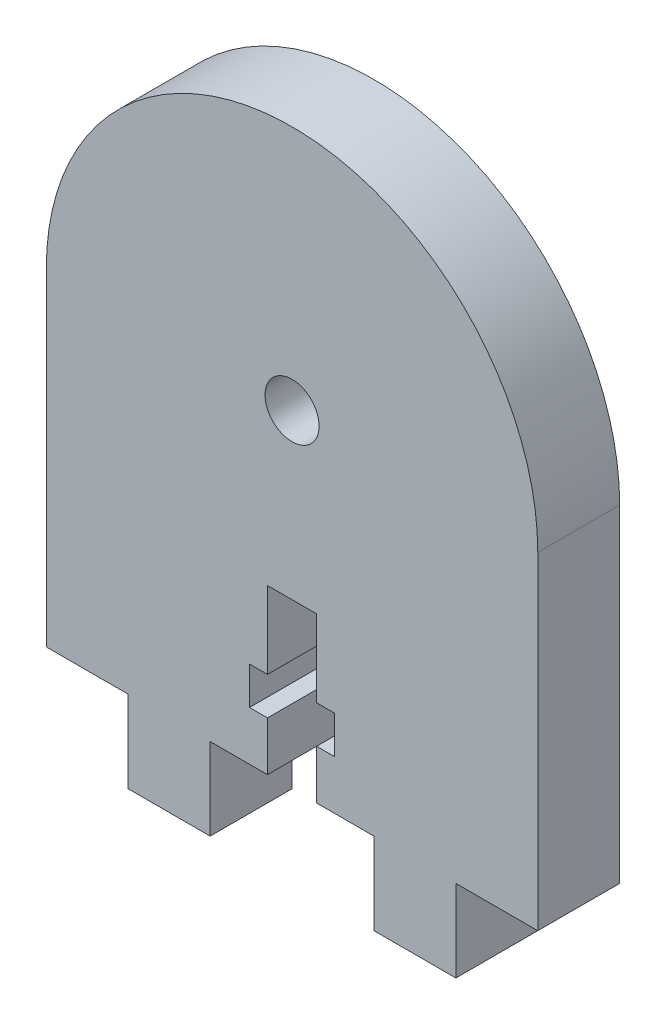
ISO-10303-21;
HEADER;
FILE_DESCRIPTION(('STEP AP214'),'2;1');
FILE_NAME('part.step','',(''),(''),'','','');
FILE_SCHEMA(('AUTOMOTIVE_DESIGN { 1 0 10303 214 1 1 1 1 }'));
ENDSEC;
DATA;
#1=APPLICATION_CONTEXT('core data for automotive mechanical design processes');
#2=APPLICATION_PROTOCOL_DEFINITION('international standard','automotive_design',2000,#1);
#3=PRODUCT_CONTEXT('',#1,'mechanical');
#4=PRODUCT('Part','Part','',(#3));
#5=PRODUCT_RELATED_PRODUCT_CATEGORY('part','',(#4));
#6=PRODUCT_DEFINITION_FORMATION('','',#4);
#7=PRODUCT_DEFINITION_CONTEXT('part definition',#1,'design');
#8=PRODUCT_DEFINITION('design','',#6,#7);
#9=PRODUCT_DEFINITION_SHAPE('','',#8);
#10=(LENGTH_UNIT() NAMED_UNIT(*) SI_UNIT(.MILLI.,.METRE.));
#11=(NAMED_UNIT(*) PLANE_ANGLE_UNIT() SI_UNIT($,.RADIAN.));
#12=(NAMED_UNIT(*) SI_UNIT($,.STERADIAN.) SOLID_ANGLE_UNIT());
#13=UNCERTAINTY_MEASURE_WITH_UNIT(LENGTH_MEASURE(1.E-05),#10,'distance_accuracy_value','');
#14=(GEOMETRIC_REPRESENTATION_CONTEXT(3) GLOBAL_UNCERTAINTY_ASSIGNED_CONTEXT((#13)) GLOBAL_UNIT_ASSIGNED_CONTEXT((#10,
#11,#12)) REPRESENTATION_CONTEXT('',''));
#15=CARTESIAN_POINT('',(0.,0.,0.));
#16=DIRECTION('',(0.,0.,1.));
#17=DIRECTION('',(1.,0.,0.));
#18=AXIS2_PLACEMENT_3D('',#15,#16,#17);
#19=CARTESIAN_POINT('',(0.,20.,5.));
#20=DIRECTION('',(0.,0.,-1.));
#21=DIRECTION('',(-1.,0.,0.));
#22=AXIS2_PLACEMENT_3D('',#19,#20,#21);
#23=PLANE('',#22);
#24=DIRECTION('',(0.,-1.,0.));
#25=VECTOR('',#24,1.);
#26=CARTESIAN_POINT('',(-10.,-5.,5.));
#27=LINE('',#26,#25);
#28=CARTESIAN_POINT('',(-10.,0.,5.));
#29=VERTEX_POINT('',#28);
#30=CARTESIAN_POINT('',(-10.,-5.,5.));
#31=VERTEX_POINT('',#30);
#32=EDGE_CURVE('E331',#29,#31,#27,.T.);
#33=ORIENTED_EDGE('',*,*,#32,.T.);
#34=DIRECTION('',(1.,0.,0.));
#35=VECTOR('',#34,1.);
#36=CARTESIAN_POINT('',(-5.,-5.,5.));
#37=LINE('',#36,#35);
#38=CARTESIAN_POINT('',(-5.,-5.,5.));
#39=VERTEX_POINT('',#38);
#40=EDGE_CURVE('E144',#31,#39,#37,.T.);
#41=ORIENTED_EDGE('',*,*,#40,.T.);
#42=DIRECTION('',(0.,1.,0.));
#43=VECTOR('',#42,1.);
#44=CARTESIAN_POINT('',(-5.,-5.,5.));
#45=LINE('',#44,#43);
#46=CARTESIAN_POINT('',(-5.,0.,5.));
#47=VERTEX_POINT('',#46);
#48=EDGE_CURVE('E323',#39,#47,#45,.T.);
#49=ORIENTED_EDGE('',*,*,#48,.T.);
#50=DIRECTION('',(1.,0.,0.));
#51=VECTOR('',#50,1.);
#52=CARTESIAN_POINT('',(-1.5,0.,5.));
#53=LINE('',#52,#51);
#54=CARTESIAN_POINT('',(-1.5,0.,5.));
#55=VERTEX_POINT('',#54);
#56=EDGE_CURVE('E319',#47,#55,#53,.T.);
#57=ORIENTED_EDGE('',*,*,#56,.T.);
#58=DIRECTION('',(0.,1.,0.));
#59=VECTOR('',#58,1.);
#60=CARTESIAN_POINT('',(-1.5,3.00000000000001,5.));
#61=LINE('',#60,#59);
#62=CARTESIAN_POINT('',(-1.5,3.00000000000001,5.));
#63=VERTEX_POINT('',#62);
#64=EDGE_CURVE('E316',#55,#63,#61,.T.);
#65=ORIENTED_EDGE('',*,*,#64,.T.);
#66=DIRECTION('',(-1.,0.,0.));
#67=VECTOR('',#66,1.);
#68=CARTESIAN_POINT('',(-1.5,3.00000000000001,5.));
#69=LINE('',#68,#67);
#70=CARTESIAN_POINT('',(-2.6,3.00000000000001,5.));
#71=VERTEX_POINT('',#70);
#72=EDGE_CURVE('E308',#63,#71,#69,.T.);
#73=ORIENTED_EDGE('',*,*,#72,.T.);
#74=DIRECTION('',(0.,1.,0.));
#75=VECTOR('',#74,1.);
#76=CARTESIAN_POINT('',(-2.6,3.00000000000001,5.));
#77=LINE('',#76,#75);
#78=CARTESIAN_POINT('',(-2.6,5.3,5.));
#79=VERTEX_POINT('',#78);
#80=EDGE_CURVE('E304',#71,#79,#77,.T.);
#81=ORIENTED_EDGE('',*,*,#80,.T.);
#82=DIRECTION('',(1.,0.,0.));
#83=VECTOR('',#82,1.);
#84=CARTESIAN_POINT('',(-2.6,5.3,5.));
#85=LINE('',#84,#83);
#86=CARTESIAN_POINT('',(-1.5,5.3,5.));
#87=VERTEX_POINT('',#86);
#88=EDGE_CURVE('E300',#79,#87,#85,.T.);
#89=ORIENTED_EDGE('',*,*,#88,.T.);
#90=DIRECTION('',(0.,1.,0.));
#91=VECTOR('',#90,1.);
#92=CARTESIAN_POINT('',(-1.5,10.,5.));
#93=LINE('',#92,#91);
#94=CARTESIAN_POINT('',(-1.5,10.,5.));
#95=VERTEX_POINT('',#94);
#96=EDGE_CURVE('E297',#87,#95,#93,.T.);
#97=ORIENTED_EDGE('',*,*,#96,.T.);
#98=DIRECTION('',(1.,0.,0.));
#99=VECTOR('',#98,1.);
#100=CARTESIAN_POINT('',(1.5,10.,5.));
#101=LINE('',#100,#99);
#102=CARTESIAN_POINT('',(1.5,10.,5.));
#103=VERTEX_POINT('',#102);
#104=EDGE_CURVE('E289',#95,#103,#101,.T.);
#105=ORIENTED_EDGE('',*,*,#104,.T.);
#106=DIRECTION('',(0.,-1.,0.));
#107=VECTOR('',#106,1.);
#108=CARTESIAN_POINT('',(1.5,5.3,5.));
#109=LINE('',#108,#107);
#110=CARTESIAN_POINT('',(1.5,5.3,5.));
#111=VERTEX_POINT('',#110);
#112=EDGE_CURVE('E285',#103,#111,#109,.T.);
#113=ORIENTED_EDGE('',*,*,#112,.T.);
#114=DIRECTION('',(1.,0.,0.));
#115=VECTOR('',#114,1.);
#116=CARTESIAN_POINT('',(1.5,5.3,5.));
#117=LINE('',#116,#115);
#118=CARTESIAN_POINT('',(2.6,5.3,5.));
#119=VERTEX_POINT('',#118);
#120=EDGE_CURVE('E281',#111,#119,#117,.T.);
#121=ORIENTED_EDGE('',*,*,#120,.T.);
#122=DIRECTION('',(0.,-1.,0.));
#123=VECTOR('',#122,1.);
#124=CARTESIAN_POINT('',(2.6,5.3,5.));
#125=LINE('',#124,#123);
#126=CARTESIAN_POINT('',(2.6,3.00000000000001,5.));
#127=VERTEX_POINT('',#126);
#128=EDGE_CURVE('E278',#119,#127,#125,.T.);
#129=ORIENTED_EDGE('',*,*,#128,.T.);
#130=DIRECTION('',(-1.,0.,0.));
#131=VECTOR('',#130,1.);
#132=CARTESIAN_POINT('',(2.6,3.00000000000001,5.));
#133=LINE('',#132,#131);
#134=CARTESIAN_POINT('',(1.5,3.00000000000001,5.));
#135=VERTEX_POINT('',#134);
#136=EDGE_CURVE('E270',#127,#135,#133,.T.);
#137=ORIENTED_EDGE('',*,*,#136,.T.);
#138=DIRECTION('',(0.,-1.,0.));
#139=VECTOR('',#138,1.);
#140=CARTESIAN_POINT('',(1.5,0.,5.));
#141=LINE('',#140,#139);
#142=CARTESIAN_POINT('',(1.5,0.,5.));
#143=VERTEX_POINT('',#142);
#144=EDGE_CURVE('E266',#135,#143,#141,.T.);
#145=ORIENTED_EDGE('',*,*,#144,.T.);
#146=DIRECTION('',(1.,0.,0.));
#147=VECTOR('',#146,1.);
#148=CARTESIAN_POINT('',(1.5,0.,5.));
#149=LINE('',#148,#147);
#150=CARTESIAN_POINT('',(5.,0.,5.));
#151=VERTEX_POINT('',#150);
#152=EDGE_CURVE('E262',#143,#151,#149,.T.);
#153=ORIENTED_EDGE('',*,*,#152,.T.);
#154=DIRECTION('',(0.,-1.,0.));
#155=VECTOR('',#154,1.);
#156=CARTESIAN_POINT('',(5.,0.,5.));
#157=LINE('',#156,#155);
#158=CARTESIAN_POINT('',(5.,-5.,5.));
#159=VERTEX_POINT('',#158);
#160=EDGE_CURVE('E259',#151,#159,#157,.T.);
#161=ORIENTED_EDGE('',*,*,#160,.T.);
#162=DIRECTION('',(1.,0.,0.));
#163=VECTOR('',#162,1.);
#164=CARTESIAN_POINT('',(5.,-5.,5.));
#165=LINE('',#164,#163);
#166=CARTESIAN_POINT('',(10.,-5.,5.));
#167=VERTEX_POINT('',#166);
#168=EDGE_CURVE('E251',#159,#167,#165,.T.);
#169=ORIENTED_EDGE('',*,*,#168,.T.);
#170=DIRECTION('',(0.,1.,0.));
#171=VECTOR('',#170,1.);
#172=CARTESIAN_POINT('',(10.,-5.,5.));
#173=LINE('',#172,#171);
#174=CARTESIAN_POINT('',(10.,0.,5.));
#175=VERTEX_POINT('',#174);
#176=EDGE_CURVE('E247',#167,#175,#173,.T.);
#177=ORIENTED_EDGE('',*,*,#176,.T.);
#178=DIRECTION('',(1.,0.,0.));
#179=VECTOR('',#178,1.);
#180=CARTESIAN_POINT('',(15.,0.,5.));
#181=LINE('',#180,#179);
#182=CARTESIAN_POINT('',(15.,0.,5.));
#183=VERTEX_POINT('',#182);
#184=EDGE_CURVE('E243',#175,#183,#181,.T.);
#185=ORIENTED_EDGE('',*,*,#184,.T.);
#186=DIRECTION('',(0.,1.,0.));
#187=VECTOR('',#186,1.);
#188=CARTESIAN_POINT('',(15.,20.,5.));
#189=LINE('',#188,#187);
#190=CARTESIAN_POINT('',(15.,20.,5.));
#191=VERTEX_POINT('',#190);
#192=EDGE_CURVE('E211',#183,#191,#189,.T.);
#193=ORIENTED_EDGE('',*,*,#192,.T.);
#194=CARTESIAN_POINT('',(0.,20.,5.));
#195=DIRECTION('',(0.,0.,1.));
#196=DIRECTION('',(-1.,0.,0.));
#197=AXIS2_PLACEMENT_3D('',#194,#195,#196);
#198=CIRCLE('',#197,15.);
#199=CARTESIAN_POINT('',(-15.,20.,5.));
#200=VERTEX_POINT('',#199);
#201=EDGE_CURVE('E205',#191,#200,#198,.T.);
#202=ORIENTED_EDGE('',*,*,#201,.T.);
#203=DIRECTION('',(0.,-1.,0.));
#204=VECTOR('',#203,1.);
#205=CARTESIAN_POINT('',(-15.,0.,5.));
#206=LINE('',#205,#204);
#207=CARTESIAN_POINT('',(-15.,0.,5.));
#208=VERTEX_POINT('',#207);
#209=EDGE_CURVE('E209',#200,#208,#206,.T.);
#210=ORIENTED_EDGE('',*,*,#209,.T.);
#211=DIRECTION('',(1.,0.,0.));
#212=VECTOR('',#211,1.);
#213=CARTESIAN_POINT('',(-10.,0.,5.));
#214=LINE('',#213,#212);
#215=EDGE_CURVE('E53',#208,#29,#214,.T.);
#216=ORIENTED_EDGE('',*,*,#215,.T.);
#217=EDGE_LOOP('',(#33,#41,#49,#57,#65,#73,#81,#89,#97,#105,#113,#121,#129,#137,#145,#153,#161,
#169,#177,#185,#193,#202,#210,#216));
#218=FACE_BOUND('',#217,.T.);
#219=CARTESIAN_POINT('',(0.,20.,5.));
#220=DIRECTION('',(0.,0.,1.));
#221=DIRECTION('',(1.,0.,0.));
#222=AXIS2_PLACEMENT_3D('',#219,#220,#221);
#223=CIRCLE('',#222,1.65);
#224=CARTESIAN_POINT('',(1.65,20.,5.));
#225=VERTEX_POINT('',#224);
#226=EDGE_CURVE('E337',#225,#225,#223,.T.);
#227=ORIENTED_EDGE('',*,*,#226,.F.);
#228=EDGE_LOOP('',(#227));
#229=FACE_BOUND('',#228,.T.);
#230=ADVANCED_FACE('F36',(#218,#229),#23,.F.);
#231=CARTESIAN_POINT('',(0.,20.,0.));
#232=DIRECTION('',(0.,0.,-1.));
#233=DIRECTION('',(-1.,0.,0.));
#234=AXIS2_PLACEMENT_3D('',#231,#232,#233);
#235=PLANE('',#234);
#236=DIRECTION('',(0.,-1.,0.));
#237=VECTOR('',#236,1.);
#238=CARTESIAN_POINT('',(-10.,-5.,0.));
#239=LINE('',#238,#237);
#240=CARTESIAN_POINT('',(-10.,0.,0.));
#241=VERTEX_POINT('',#240);
#242=CARTESIAN_POINT('',(-10.,-5.,0.));
#243=VERTEX_POINT('',#242);
#244=EDGE_CURVE('E341',#241,#243,#239,.T.);
#245=ORIENTED_EDGE('',*,*,#244,.F.);
#246=DIRECTION('',(1.,0.,0.));
#247=VECTOR('',#246,1.);
#248=CARTESIAN_POINT('',(-10.,0.,0.));
#249=LINE('',#248,#247);
#250=CARTESIAN_POINT('',(-15.,0.,0.));
#251=VERTEX_POINT('',#250);
#252=EDGE_CURVE('E136',#251,#241,#249,.T.);
#253=ORIENTED_EDGE('',*,*,#252,.F.);
#254=DIRECTION('',(0.,-1.,0.));
#255=VECTOR('',#254,1.);
#256=CARTESIAN_POINT('',(-15.,0.,0.));
#257=LINE('',#256,#255);
#258=CARTESIAN_POINT('',(-15.,20.,0.));
#259=VERTEX_POINT('',#258);
#260=EDGE_CURVE('E130',#259,#251,#257,.T.);
#261=ORIENTED_EDGE('',*,*,#260,.F.);
#262=CARTESIAN_POINT('',(0.,20.,0.));
#263=DIRECTION('',(0.,0.,1.));
#264=DIRECTION('',(-1.,0.,0.));
#265=AXIS2_PLACEMENT_3D('',#262,#263,#264);
#266=CIRCLE('',#265,15.);
#267=CARTESIAN_POINT('',(15.,20.,0.));
#268=VERTEX_POINT('',#267);
#269=EDGE_CURVE('E220',#268,#259,#266,.T.);
#270=ORIENTED_EDGE('',*,*,#269,.F.);
#271=DIRECTION('',(0.,1.,0.));
#272=VECTOR('',#271,1.);
#273=CARTESIAN_POINT('',(15.,20.,0.));
#274=LINE('',#273,#272);
#275=CARTESIAN_POINT('',(15.,0.,0.));
#276=VERTEX_POINT('',#275);
#277=EDGE_CURVE('E387',#276,#268,#274,.T.);
#278=ORIENTED_EDGE('',*,*,#277,.F.);
#279=DIRECTION('',(1.,0.,0.));
#280=VECTOR('',#279,1.);
#281=CARTESIAN_POINT('',(15.,0.,0.));
#282=LINE('',#281,#280);
#283=CARTESIAN_POINT('',(10.,0.,0.));
#284=VERTEX_POINT('',#283);
#285=EDGE_CURVE('E385',#284,#276,#282,.T.);
#286=ORIENTED_EDGE('',*,*,#285,.F.);
#287=DIRECTION('',(0.,1.,0.));
#288=VECTOR('',#287,1.);
#289=CARTESIAN_POINT('',(10.,-5.,0.));
#290=LINE('',#289,#288);
#291=CARTESIAN_POINT('',(10.,-5.,0.));
#292=VERTEX_POINT('',#291);
#293=EDGE_CURVE('E383',#292,#284,#290,.T.);
#294=ORIENTED_EDGE('',*,*,#293,.F.);
#295=DIRECTION('',(1.,0.,0.));
#296=VECTOR('',#295,1.);
#297=CARTESIAN_POINT('',(5.,-5.,0.));
#298=LINE('',#297,#296);
#299=CARTESIAN_POINT('',(5.,-5.,0.));
#300=VERTEX_POINT('',#299);
#301=EDGE_CURVE('E381',#300,#292,#298,.T.);
#302=ORIENTED_EDGE('',*,*,#301,.F.);
#303=DIRECTION('',(0.,-1.,0.));
#304=VECTOR('',#303,1.);
#305=CARTESIAN_POINT('',(5.,0.,0.));
#306=LINE('',#305,#304);
#307=CARTESIAN_POINT('',(5.,0.,0.));
#308=VERTEX_POINT('',#307);
#309=EDGE_CURVE('E379',#308,#300,#306,.T.);
#310=ORIENTED_EDGE('',*,*,#309,.F.);
#311=DIRECTION('',(1.,0.,0.));
#312=VECTOR('',#311,1.);
#313=CARTESIAN_POINT('',(1.5,0.,0.));
#314=LINE('',#313,#312);
#315=CARTESIAN_POINT('',(1.5,0.,0.));
#316=VERTEX_POINT('',#315);
#317=EDGE_CURVE('E377',#316,#308,#314,.T.);
#318=ORIENTED_EDGE('',*,*,#317,.F.);
#319=DIRECTION('',(0.,-1.,0.));
#320=VECTOR('',#319,1.);
#321=CARTESIAN_POINT('',(1.5,0.,0.));
#322=LINE('',#321,#320);
#323=CARTESIAN_POINT('',(1.5,3.00000000000001,0.));
#324=VERTEX_POINT('',#323);
#325=EDGE_CURVE('E375',#324,#316,#322,.T.);
#326=ORIENTED_EDGE('',*,*,#325,.F.);
#327=DIRECTION('',(-1.,0.,0.));
#328=VECTOR('',#327,1.);
#329=CARTESIAN_POINT('',(2.6,3.00000000000001,0.));
#330=LINE('',#329,#328);
#331=CARTESIAN_POINT('',(2.6,3.00000000000001,0.));
#332=VERTEX_POINT('',#331);
#333=EDGE_CURVE('E373',#332,#324,#330,.T.);
#334=ORIENTED_EDGE('',*,*,#333,.F.);
#335=DIRECTION('',(0.,-1.,0.));
#336=VECTOR('',#335,1.);
#337=CARTESIAN_POINT('',(2.6,5.3,0.));
#338=LINE('',#337,#336);
#339=CARTESIAN_POINT('',(2.6,5.3,0.));
#340=VERTEX_POINT('',#339);
#341=EDGE_CURVE('E371',#340,#332,#338,.T.);
#342=ORIENTED_EDGE('',*,*,#341,.F.);
#343=DIRECTION('',(1.,0.,0.));
#344=VECTOR('',#343,1.);
#345=CARTESIAN_POINT('',(1.5,5.3,0.));
#346=LINE('',#345,#344);
#347=CARTESIAN_POINT('',(1.5,5.3,0.));
#348=VERTEX_POINT('',#347);
#349=EDGE_CURVE('E369',#348,#340,#346,.T.);
#350=ORIENTED_EDGE('',*,*,#349,.F.);
#351=DIRECTION('',(0.,-1.,0.));
#352=VECTOR('',#351,1.);
#353=CARTESIAN_POINT('',(1.5,5.3,0.));
#354=LINE('',#353,#352);
#355=CARTESIAN_POINT('',(1.5,10.,0.));
#356=VERTEX_POINT('',#355);
#357=EDGE_CURVE('E367',#356,#348,#354,.T.);
#358=ORIENTED_EDGE('',*,*,#357,.F.);
#359=DIRECTION('',(1.,0.,0.));
#360=VECTOR('',#359,1.);
#361=CARTESIAN_POINT('',(1.5,10.,0.));
#362=LINE('',#361,#360);
#363=CARTESIAN_POINT('',(-1.5,10.,0.));
#364=VERTEX_POINT('',#363);
#365=EDGE_CURVE('E365',#364,#356,#362,.T.);
#366=ORIENTED_EDGE('',*,*,#365,.F.);
#367=DIRECTION('',(0.,1.,0.));
#368=VECTOR('',#367,1.);
#369=CARTESIAN_POINT('',(-1.5,10.,0.));
#370=LINE('',#369,#368);
#371=CARTESIAN_POINT('',(-1.5,5.3,0.));
#372=VERTEX_POINT('',#371);
#373=EDGE_CURVE('E363',#372,#364,#370,.T.);
#374=ORIENTED_EDGE('',*,*,#373,.F.);
#375=DIRECTION('',(1.,0.,0.));
#376=VECTOR('',#375,1.);
#377=CARTESIAN_POINT('',(-2.6,5.3,0.));
#378=LINE('',#377,#376);
#379=CARTESIAN_POINT('',(-2.6,5.3,0.));
#380=VERTEX_POINT('',#379);
#381=EDGE_CURVE('E361',#380,#372,#378,.T.);
#382=ORIENTED_EDGE('',*,*,#381,.F.);
#383=DIRECTION('',(0.,1.,0.));
#384=VECTOR('',#383,1.);
#385=CARTESIAN_POINT('',(-2.6,3.00000000000001,0.));
#386=LINE('',#385,#384);
#387=CARTESIAN_POINT('',(-2.6,3.00000000000001,0.));
#388=VERTEX_POINT('',#387);
#389=EDGE_CURVE('E359',#388,#380,#386,.T.);
#390=ORIENTED_EDGE('',*,*,#389,.F.);
#391=DIRECTION('',(-1.,0.,0.));
#392=VECTOR('',#391,1.);
#393=CARTESIAN_POINT('',(-1.5,3.00000000000001,0.));
#394=LINE('',#393,#392);
#395=CARTESIAN_POINT('',(-1.5,3.00000000000001,0.));
#396=VERTEX_POINT('',#395);
#397=EDGE_CURVE('E357',#396,#388,#394,.T.);
#398=ORIENTED_EDGE('',*,*,#397,.F.);
#399=DIRECTION('',(0.,1.,0.));
#400=VECTOR('',#399,1.);
#401=CARTESIAN_POINT('',(-1.5,3.00000000000001,0.));
#402=LINE('',#401,#400);
#403=CARTESIAN_POINT('',(-1.5,0.,0.));
#404=VERTEX_POINT('',#403);
#405=EDGE_CURVE('E355',#404,#396,#402,.T.);
#406=ORIENTED_EDGE('',*,*,#405,.F.);
#407=DIRECTION('',(1.,0.,0.));
#408=VECTOR('',#407,1.);
#409=CARTESIAN_POINT('',(-1.5,0.,0.));
#410=LINE('',#409,#408);
#411=CARTESIAN_POINT('',(-5.,0.,0.));
#412=VERTEX_POINT('',#411);
#413=EDGE_CURVE('E353',#412,#404,#410,.T.);
#414=ORIENTED_EDGE('',*,*,#413,.F.);
#415=DIRECTION('',(0.,1.,0.));
#416=VECTOR('',#415,1.);
#417=CARTESIAN_POINT('',(-5.,-5.,0.));
#418=LINE('',#417,#416);
#419=CARTESIAN_POINT('',(-5.,-5.,0.));
#420=VERTEX_POINT('',#419);
#421=EDGE_CURVE('E349',#420,#412,#418,.T.);
#422=ORIENTED_EDGE('',*,*,#421,.F.);
#423=DIRECTION('',(1.,0.,0.));
#424=VECTOR('',#423,1.);
#425=CARTESIAN_POINT('',(-5.,-5.,0.));
#426=LINE('',#425,#424);
#427=EDGE_CURVE('E345',#243,#420,#426,.T.);
#428=ORIENTED_EDGE('',*,*,#427,.F.);
#429=EDGE_LOOP('',(#245,#253,#261,#270,#278,#286,#294,#302,#310,#318,#326,#334,#342,#350,#358,
#366,#374,#382,#390,#398,#406,#414,#422,#428));
#430=FACE_BOUND('',#429,.T.);
#431=CARTESIAN_POINT('',(0.,20.,0.));
#432=DIRECTION('',(0.,0.,1.));
#433=DIRECTION('',(1.,0.,0.));
#434=AXIS2_PLACEMENT_3D('',#431,#432,#433);
#435=CIRCLE('',#434,1.65);
#436=CARTESIAN_POINT('',(1.65,20.,0.));
#437=VERTEX_POINT('',#436);
#438=EDGE_CURVE('E335',#437,#437,#435,.T.);
#439=ORIENTED_EDGE('',*,*,#438,.T.);
#440=EDGE_LOOP('',(#439));
#441=FACE_BOUND('',#440,.T.);
#442=ADVANCED_FACE('F456',(#430,#441),#235,.T.);
#443=CARTESIAN_POINT('',(-10.,-5.,5.));
#444=DIRECTION('',(1.,0.,0.));
#445=DIRECTION('',(0.,0.,-1.));
#446=AXIS2_PLACEMENT_3D('',#443,#444,#445);
#447=PLANE('',#446);
#448=ORIENTED_EDGE('',*,*,#244,.T.);
#449=DIRECTION('',(0.,0.,-1.));
#450=VECTOR('',#449,1.);
#451=CARTESIAN_POINT('',(-10.,-5.,5.));
#452=LINE('',#451,#450);
#453=EDGE_CURVE('E12',#31,#243,#452,.T.);
#454=ORIENTED_EDGE('',*,*,#453,.F.);
#455=ORIENTED_EDGE('',*,*,#32,.F.);
#456=DIRECTION('',(0.,0.,-1.));
#457=VECTOR('',#456,1.);
#458=CARTESIAN_POINT('',(-10.,0.,5.));
#459=LINE('',#458,#457);
#460=EDGE_CURVE('E228',#29,#241,#459,.T.);
#461=ORIENTED_EDGE('',*,*,#460,.T.);
#462=EDGE_LOOP('',(#448,#454,#455,#461));
#463=FACE_BOUND('',#462,.T.);
#464=ADVANCED_FACE('F38',(#463),#447,.F.);
#465=CARTESIAN_POINT('',(-5.,-5.,5.));
#466=DIRECTION('',(0.,1.,0.));
#467=DIRECTION('',(0.,0.,1.));
#468=AXIS2_PLACEMENT_3D('',#465,#466,#467);
#469=PLANE('',#468);
#470=ORIENTED_EDGE('',*,*,#427,.T.);
#471=DIRECTION('',(0.,0.,-1.));
#472=VECTOR('',#471,1.);
#473=CARTESIAN_POINT('',(-5.,-5.,5.));
#474=LINE('',#473,#472);
#475=EDGE_CURVE('E45',#39,#420,#474,.T.);
#476=ORIENTED_EDGE('',*,*,#475,.F.);
#477=ORIENTED_EDGE('',*,*,#40,.F.);
#478=ORIENTED_EDGE('',*,*,#453,.T.);
#479=EDGE_LOOP('',(#470,#476,#477,#478));
#480=FACE_BOUND('',#479,.T.);
#481=ADVANCED_FACE('F739',(#480),#469,.F.);
#482=CARTESIAN_POINT('',(-5.,-5.,5.));
#483=DIRECTION('',(-1.,0.,0.));
#484=DIRECTION('',(0.,-1.,0.));
#485=AXIS2_PLACEMENT_3D('',#482,#483,#484);
#486=PLANE('',#485);
#487=ORIENTED_EDGE('',*,*,#421,.T.);
#488=DIRECTION('',(0.,0.,-1.));
#489=VECTOR('',#488,1.);
#490=CARTESIAN_POINT('',(-5.,0.,5.));
#491=LINE('',#490,#489);
#492=EDGE_CURVE('E446',#47,#412,#491,.T.);
#493=ORIENTED_EDGE('',*,*,#492,.F.);
#494=ORIENTED_EDGE('',*,*,#48,.F.);
#495=ORIENTED_EDGE('',*,*,#475,.T.);
#496=EDGE_LOOP('',(#487,#493,#494,#495));
#497=FACE_BOUND('',#496,.T.);
#498=ADVANCED_FACE('F452',(#497),#486,.F.);
#499=CARTESIAN_POINT('',(-1.5,0.,5.));
#500=DIRECTION('',(0.,1.,0.));
#501=DIRECTION('',(-1.,0.,0.));
#502=AXIS2_PLACEMENT_3D('',#499,#500,#501);
#503=PLANE('',#502);
#504=ORIENTED_EDGE('',*,*,#413,.T.);
#505=DIRECTION('',(0.,0.,-1.));
#506=VECTOR('',#505,1.);
#507=CARTESIAN_POINT('',(-1.5,0.,5.));
#508=LINE('',#507,#506);
#509=EDGE_CURVE('E443',#55,#404,#508,.T.);
#510=ORIENTED_EDGE('',*,*,#509,.F.);
#511=ORIENTED_EDGE('',*,*,#56,.F.);
#512=ORIENTED_EDGE('',*,*,#492,.T.);
#513=EDGE_LOOP('',(#504,#510,#511,#512));
#514=FACE_BOUND('',#513,.T.);
#515=ADVANCED_FACE('F462',(#514),#503,.F.);
#516=CARTESIAN_POINT('',(-1.5,3.00000000000001,5.));
#517=DIRECTION('',(-1.,0.,0.));
#518=DIRECTION('',(0.,-1.,0.));
#519=AXIS2_PLACEMENT_3D('',#516,#517,#518);
#520=PLANE('',#519);
#521=ORIENTED_EDGE('',*,*,#405,.T.);
#522=DIRECTION('',(0.,0.,-1.));
#523=VECTOR('',#522,1.);
#524=CARTESIAN_POINT('',(-1.5,3.00000000000001,5.));
#525=LINE('',#524,#523);
#526=EDGE_CURVE('E440',#63,#396,#525,.T.);
#527=ORIENTED_EDGE('',*,*,#526,.F.);
#528=ORIENTED_EDGE('',*,*,#64,.F.);
#529=ORIENTED_EDGE('',*,*,#509,.T.);
#530=EDGE_LOOP('',(#521,#527,#528,#529));
#531=FACE_BOUND('',#530,.T.);
#532=ADVANCED_FACE('F466',(#531),#520,.F.);
#533=CARTESIAN_POINT('',(-1.5,3.00000000000001,5.));
#534=DIRECTION('',(0.,-1.,0.));
#535=DIRECTION('',(1.,0.,0.));
#536=AXIS2_PLACEMENT_3D('',#533,#534,#535);
#537=PLANE('',#536);
#538=ORIENTED_EDGE('',*,*,#397,.T.);
#539=DIRECTION('',(0.,0.,-1.));
#540=VECTOR('',#539,1.);
#541=CARTESIAN_POINT('',(-2.6,3.00000000000001,5.));
#542=LINE('',#541,#540);
#543=EDGE_CURVE('E437',#71,#388,#542,.T.);
#544=ORIENTED_EDGE('',*,*,#543,.F.);
#545=ORIENTED_EDGE('',*,*,#72,.F.);
#546=ORIENTED_EDGE('',*,*,#526,.T.);
#547=EDGE_LOOP('',(#538,#544,#545,#546));
#548=FACE_BOUND('',#547,.T.);
#549=ADVANCED_FACE('F550',(#548),#537,.F.);
#550=CARTESIAN_POINT('',(-2.6,3.00000000000001,5.));
#551=DIRECTION('',(-1.,0.,0.));
#552=DIRECTION('',(0.,-1.,0.));
#553=AXIS2_PLACEMENT_3D('',#550,#551,#552);
#554=PLANE('',#553);
#555=ORIENTED_EDGE('',*,*,#389,.T.);
#556=DIRECTION('',(0.,0.,-1.));
#557=VECTOR('',#556,1.);
#558=CARTESIAN_POINT('',(-2.6,5.3,5.));
#559=LINE('',#558,#557);
#560=EDGE_CURVE('E434',#79,#380,#559,.T.);
#561=ORIENTED_EDGE('',*,*,#560,.F.);
#562=ORIENTED_EDGE('',*,*,#80,.F.);
#563=ORIENTED_EDGE('',*,*,#543,.T.);
#564=EDGE_LOOP('',(#555,#561,#562,#563));
#565=FACE_BOUND('',#564,.T.);
#566=ADVANCED_FACE('F548',(#565),#554,.F.);
#567=CARTESIAN_POINT('',(-2.6,5.3,5.));
#568=DIRECTION('',(0.,1.,0.));
#569=DIRECTION('',(-1.,0.,0.));
#570=AXIS2_PLACEMENT_3D('',#567,#568,#569);
#571=PLANE('',#570);
#572=ORIENTED_EDGE('',*,*,#381,.T.);
#573=DIRECTION('',(0.,0.,-1.));
#574=VECTOR('',#573,1.);
#575=CARTESIAN_POINT('',(-1.5,5.3,5.));
#576=LINE('',#575,#574);
#577=EDGE_CURVE('E431',#87,#372,#576,.T.);
#578=ORIENTED_EDGE('',*,*,#577,.F.);
#579=ORIENTED_EDGE('',*,*,#88,.F.);
#580=ORIENTED_EDGE('',*,*,#560,.T.);
#581=EDGE_LOOP('',(#572,#578,#579,#580));
#582=FACE_BOUND('',#581,.T.);
#583=ADVANCED_FACE('F543',(#582),#571,.F.);
#584=CARTESIAN_POINT('',(-1.5,10.,5.));
#585=DIRECTION('',(-1.,0.,0.));
#586=DIRECTION('',(0.,-1.,0.));
#587=AXIS2_PLACEMENT_3D('',#584,#585,#586);
#588=PLANE('',#587);
#589=ORIENTED_EDGE('',*,*,#373,.T.);
#590=DIRECTION('',(0.,0.,-1.));
#591=VECTOR('',#590,1.);
#592=CARTESIAN_POINT('',(-1.5,10.,5.));
#593=LINE('',#592,#591);
#594=EDGE_CURVE('E428',#95,#364,#593,.T.);
#595=ORIENTED_EDGE('',*,*,#594,.F.);
#596=ORIENTED_EDGE('',*,*,#96,.F.);
#597=ORIENTED_EDGE('',*,*,#577,.T.);
#598=EDGE_LOOP('',(#589,#595,#596,#597));
#599=FACE_BOUND('',#598,.T.);
#600=ADVANCED_FACE('F538',(#599),#588,.F.);
#601=CARTESIAN_POINT('',(1.5,10.,5.));
#602=DIRECTION('',(0.,1.,0.));
#603=DIRECTION('',(0.,0.,1.));
#604=AXIS2_PLACEMENT_3D('',#601,#602,#603);
#605=PLANE('',#604);
#606=ORIENTED_EDGE('',*,*,#365,.T.);
#607=DIRECTION('',(0.,0.,-1.));
#608=VECTOR('',#607,1.);
#609=CARTESIAN_POINT('',(1.5,10.,5.));
#610=LINE('',#609,#608);
#611=EDGE_CURVE('E425',#103,#356,#610,.T.);
#612=ORIENTED_EDGE('',*,*,#611,.F.);
#613=ORIENTED_EDGE('',*,*,#104,.F.);
#614=ORIENTED_EDGE('',*,*,#594,.T.);
#615=EDGE_LOOP('',(#606,#612,#613,#614));
#616=FACE_BOUND('',#615,.T.);
#617=ADVANCED_FACE('F534',(#616),#605,.F.);
#618=CARTESIAN_POINT('',(1.5,5.3,5.));
#619=DIRECTION('',(1.,0.,0.));
#620=DIRECTION('',(0.,1.,0.));
#621=AXIS2_PLACEMENT_3D('',#618,#619,#620);
#622=PLANE('',#621);
#623=ORIENTED_EDGE('',*,*,#357,.T.);
#624=DIRECTION('',(0.,0.,-1.));
#625=VECTOR('',#624,1.);
#626=CARTESIAN_POINT('',(1.5,5.3,5.));
#627=LINE('',#626,#625);
#628=EDGE_CURVE('E422',#111,#348,#627,.T.);
#629=ORIENTED_EDGE('',*,*,#628,.F.);
#630=ORIENTED_EDGE('',*,*,#112,.F.);
#631=ORIENTED_EDGE('',*,*,#611,.T.);
#632=EDGE_LOOP('',(#623,#629,#630,#631));
#633=FACE_BOUND('',#632,.T.);
#634=ADVANCED_FACE('F529',(#633),#622,.F.);
#635=CARTESIAN_POINT('',(1.5,5.3,5.));
#636=DIRECTION('',(0.,1.,0.));
#637=DIRECTION('',(-1.,0.,0.));
#638=AXIS2_PLACEMENT_3D('',#635,#636,#637);
#639=PLANE('',#638);
#640=ORIENTED_EDGE('',*,*,#349,.T.);
#641=DIRECTION('',(0.,0.,-1.));
#642=VECTOR('',#641,1.);
#643=CARTESIAN_POINT('',(2.6,5.3,5.));
#644=LINE('',#643,#642);
#645=EDGE_CURVE('E419',#119,#340,#644,.T.);
#646=ORIENTED_EDGE('',*,*,#645,.F.);
#647=ORIENTED_EDGE('',*,*,#120,.F.);
#648=ORIENTED_EDGE('',*,*,#628,.T.);
#649=EDGE_LOOP('',(#640,#646,#647,#648));
#650=FACE_BOUND('',#649,.T.);
#651=ADVANCED_FACE('F523',(#650),#639,.F.);
#652=CARTESIAN_POINT('',(2.6,5.3,5.));
#653=DIRECTION('',(1.,0.,0.));
#654=DIRECTION('',(0.,1.,0.));
#655=AXIS2_PLACEMENT_3D('',#652,#653,#654);
#656=PLANE('',#655);
#657=ORIENTED_EDGE('',*,*,#341,.T.);
#658=DIRECTION('',(0.,0.,-1.));
#659=VECTOR('',#658,1.);
#660=CARTESIAN_POINT('',(2.6,3.00000000000001,5.));
#661=LINE('',#660,#659);
#662=EDGE_CURVE('E416',#127,#332,#661,.T.);
#663=ORIENTED_EDGE('',*,*,#662,.F.);
#664=ORIENTED_EDGE('',*,*,#128,.F.);
#665=ORIENTED_EDGE('',*,*,#645,.T.);
#666=EDGE_LOOP('',(#657,#663,#664,#665));
#667=FACE_BOUND('',#666,.T.);
#668=ADVANCED_FACE('F519',(#667),#656,.F.);
#669=CARTESIAN_POINT('',(2.6,3.00000000000001,5.));
#670=DIRECTION('',(0.,-1.,0.));
#671=DIRECTION('',(0.,0.,-1.));
#672=AXIS2_PLACEMENT_3D('',#669,#670,#671);
#673=PLANE('',#672);
#674=ORIENTED_EDGE('',*,*,#333,.T.);
#675=DIRECTION('',(0.,0.,-1.));
#676=VECTOR('',#675,1.);
#677=CARTESIAN_POINT('',(1.5,3.00000000000001,5.));
#678=LINE('',#677,#676);
#679=EDGE_CURVE('E413',#135,#324,#678,.T.);
#680=ORIENTED_EDGE('',*,*,#679,.F.);
#681=ORIENTED_EDGE('',*,*,#136,.F.);
#682=ORIENTED_EDGE('',*,*,#662,.T.);
#683=EDGE_LOOP('',(#674,#680,#681,#682));
#684=FACE_BOUND('',#683,.T.);
#685=ADVANCED_FACE('F514',(#684),#673,.F.);
#686=CARTESIAN_POINT('',(1.5,0.,5.));
#687=DIRECTION('',(1.,0.,0.));
#688=DIRECTION('',(0.,1.,0.));
#689=AXIS2_PLACEMENT_3D('',#686,#687,#688);
#690=PLANE('',#689);
#691=ORIENTED_EDGE('',*,*,#325,.T.);
#692=DIRECTION('',(0.,0.,-1.));
#693=VECTOR('',#692,1.);
#694=CARTESIAN_POINT('',(1.5,0.,5.));
#695=LINE('',#694,#693);
#696=EDGE_CURVE('E410',#143,#316,#695,.T.);
#697=ORIENTED_EDGE('',*,*,#696,.F.);
#698=ORIENTED_EDGE('',*,*,#144,.F.);
#699=ORIENTED_EDGE('',*,*,#679,.T.);
#700=EDGE_LOOP('',(#691,#697,#698,#699));
#701=FACE_BOUND('',#700,.T.);
#702=ADVANCED_FACE('F508',(#701),#690,.F.);
#703=CARTESIAN_POINT('',(1.5,0.,5.));
#704=DIRECTION('',(0.,1.,0.));
#705=DIRECTION('',(-1.,0.,0.));
#706=AXIS2_PLACEMENT_3D('',#703,#704,#705);
#707=PLANE('',#706);
#708=ORIENTED_EDGE('',*,*,#317,.T.);
#709=DIRECTION('',(0.,0.,-1.));
#710=VECTOR('',#709,1.);
#711=CARTESIAN_POINT('',(5.,0.,5.));
#712=LINE('',#711,#710);
#713=EDGE_CURVE('E407',#151,#308,#712,.T.);
#714=ORIENTED_EDGE('',*,*,#713,.F.);
#715=ORIENTED_EDGE('',*,*,#152,.F.);
#716=ORIENTED_EDGE('',*,*,#696,.T.);
#717=EDGE_LOOP('',(#708,#714,#715,#716));
#718=FACE_BOUND('',#717,.T.);
#719=ADVANCED_FACE('F504',(#718),#707,.F.);
#720=CARTESIAN_POINT('',(5.,0.,5.));
#721=DIRECTION('',(1.,0.,0.));
#722=DIRECTION('',(0.,1.,0.));
#723=AXIS2_PLACEMENT_3D('',#720,#721,#722);
#724=PLANE('',#723);
#725=ORIENTED_EDGE('',*,*,#309,.T.);
#726=DIRECTION('',(0.,0.,-1.));
#727=VECTOR('',#726,1.);
#728=CARTESIAN_POINT('',(5.,-5.,5.));
#729=LINE('',#728,#727);
#730=EDGE_CURVE('E404',#159,#300,#729,.T.);
#731=ORIENTED_EDGE('',*,*,#730,.F.);
#732=ORIENTED_EDGE('',*,*,#160,.F.);
#733=ORIENTED_EDGE('',*,*,#713,.T.);
#734=EDGE_LOOP('',(#725,#731,#732,#733));
#735=FACE_BOUND('',#734,.T.);
#736=ADVANCED_FACE('F500',(#735),#724,.F.);
#737=CARTESIAN_POINT('',(5.,-5.,5.));
#738=DIRECTION('',(0.,1.,0.));
#739=DIRECTION('',(0.,0.,1.));
#740=AXIS2_PLACEMENT_3D('',#737,#738,#739);
#741=PLANE('',#740);
#742=ORIENTED_EDGE('',*,*,#301,.T.);
#743=DIRECTION('',(0.,0.,-1.));
#744=VECTOR('',#743,1.);
#745=CARTESIAN_POINT('',(10.,-5.,5.));
#746=LINE('',#745,#744);
#747=EDGE_CURVE('E401',#167,#292,#746,.T.);
#748=ORIENTED_EDGE('',*,*,#747,.F.);
#749=ORIENTED_EDGE('',*,*,#168,.F.);
#750=ORIENTED_EDGE('',*,*,#730,.T.);
#751=EDGE_LOOP('',(#742,#748,#749,#750));
#752=FACE_BOUND('',#751,.T.);
#753=ADVANCED_FACE('F483',(#752),#741,.F.);
#754=CARTESIAN_POINT('',(10.,-5.,5.));
#755=DIRECTION('',(-1.,0.,0.));
#756=DIRECTION('',(0.,0.,1.));
#757=AXIS2_PLACEMENT_3D('',#754,#755,#756);
#758=PLANE('',#757);
#759=ORIENTED_EDGE('',*,*,#293,.T.);
#760=DIRECTION('',(0.,0.,-1.));
#761=VECTOR('',#760,1.);
#762=CARTESIAN_POINT('',(10.,0.,5.));
#763=LINE('',#762,#761);
#764=EDGE_CURVE('E398',#175,#284,#763,.T.);
#765=ORIENTED_EDGE('',*,*,#764,.F.);
#766=ORIENTED_EDGE('',*,*,#176,.F.);
#767=ORIENTED_EDGE('',*,*,#747,.T.);
#768=EDGE_LOOP('',(#759,#765,#766,#767));
#769=FACE_BOUND('',#768,.T.);
#770=ADVANCED_FACE('F487',(#769),#758,.F.);
#771=CARTESIAN_POINT('',(15.,0.,5.));
#772=DIRECTION('',(0.,1.,0.));
#773=DIRECTION('',(-1.,0.,0.));
#774=AXIS2_PLACEMENT_3D('',#771,#772,#773);
#775=PLANE('',#774);
#776=ORIENTED_EDGE('',*,*,#285,.T.);
#777=DIRECTION('',(0.,0.,-1.));
#778=VECTOR('',#777,1.);
#779=CARTESIAN_POINT('',(15.,0.,5.));
#780=LINE('',#779,#778);
#781=EDGE_CURVE('E395',#183,#276,#780,.T.);
#782=ORIENTED_EDGE('',*,*,#781,.F.);
#783=ORIENTED_EDGE('',*,*,#184,.F.);
#784=ORIENTED_EDGE('',*,*,#764,.T.);
#785=EDGE_LOOP('',(#776,#782,#783,#784));
#786=FACE_BOUND('',#785,.T.);
#787=ADVANCED_FACE('F492',(#786),#775,.F.);
#788=CARTESIAN_POINT('',(15.,20.,5.));
#789=DIRECTION('',(-1.,0.,0.));
#790=DIRECTION('',(0.,-1.,0.));
#791=AXIS2_PLACEMENT_3D('',#788,#789,#790);
#792=PLANE('',#791);
#793=ORIENTED_EDGE('',*,*,#277,.T.);
#794=DIRECTION('',(0.,0.,-1.));
#795=VECTOR('',#794,1.);
#796=CARTESIAN_POINT('',(15.,20.,5.));
#797=LINE('',#796,#795);
#798=EDGE_CURVE('E221',#191,#268,#797,.T.);
#799=ORIENTED_EDGE('',*,*,#798,.F.);
#800=ORIENTED_EDGE('',*,*,#192,.F.);
#801=ORIENTED_EDGE('',*,*,#781,.T.);
#802=EDGE_LOOP('',(#793,#799,#800,#801));
#803=FACE_BOUND('',#802,.T.);
#804=ADVANCED_FACE('F495',(#803),#792,.F.);
#805=CARTESIAN_POINT('',(0.,20.,5.));
#806=DIRECTION('',(0.,0.,-1.));
#807=DIRECTION('',(-1.,0.,0.));
#808=AXIS2_PLACEMENT_3D('',#805,#806,#807);
#809=CYLINDRICAL_SURFACE('',#808,15.);
#810=ORIENTED_EDGE('',*,*,#269,.T.);
#811=DIRECTION('',(0.,0.,-1.));
#812=VECTOR('',#811,1.);
#813=CARTESIAN_POINT('',(-15.,20.,5.));
#814=LINE('',#813,#812);
#815=EDGE_CURVE('E217',#200,#259,#814,.T.);
#816=ORIENTED_EDGE('',*,*,#815,.F.);
#817=ORIENTED_EDGE('',*,*,#201,.F.);
#818=ORIENTED_EDGE('',*,*,#798,.T.);
#819=EDGE_LOOP('',(#810,#816,#817,#818));
#820=FACE_BOUND('',#819,.T.);
#821=ADVANCED_FACE('F218',(#820),#809,.T.);
#822=CARTESIAN_POINT('',(-15.,0.,5.));
#823=DIRECTION('',(1.,0.,0.));
#824=DIRECTION('',(0.,0.,-1.));
#825=AXIS2_PLACEMENT_3D('',#822,#823,#824);
#826=PLANE('',#825);
#827=ORIENTED_EDGE('',*,*,#260,.T.);
#828=DIRECTION('',(0.,0.,-1.));
#829=VECTOR('',#828,1.);
#830=CARTESIAN_POINT('',(-15.,0.,5.));
#831=LINE('',#830,#829);
#832=EDGE_CURVE('E222',#208,#251,#831,.T.);
#833=ORIENTED_EDGE('',*,*,#832,.F.);
#834=ORIENTED_EDGE('',*,*,#209,.F.);
#835=ORIENTED_EDGE('',*,*,#815,.T.);
#836=EDGE_LOOP('',(#827,#833,#834,#835));
#837=FACE_BOUND('',#836,.T.);
#838=ADVANCED_FACE('F224',(#837),#826,.F.);
#839=CARTESIAN_POINT('',(-10.,0.,5.));
#840=DIRECTION('',(0.,1.,0.));
#841=DIRECTION('',(-1.,0.,0.));
#842=AXIS2_PLACEMENT_3D('',#839,#840,#841);
#843=PLANE('',#842);
#844=ORIENTED_EDGE('',*,*,#252,.T.);
#845=ORIENTED_EDGE('',*,*,#460,.F.);
#846=ORIENTED_EDGE('',*,*,#215,.F.);
#847=ORIENTED_EDGE('',*,*,#832,.T.);
#848=EDGE_LOOP('',(#844,#845,#846,#847));
#849=FACE_BOUND('',#848,.T.);
#850=ADVANCED_FACE('F568',(#849),#843,.F.);
#851=CARTESIAN_POINT('',(0.,20.,5.));
#852=DIRECTION('',(0.,0.,-1.));
#853=DIRECTION('',(-1.,0.,0.));
#854=AXIS2_PLACEMENT_3D('',#851,#852,#853);
#855=CYLINDRICAL_SURFACE('',#854,1.65);
#856=ORIENTED_EDGE('',*,*,#226,.T.);
#857=EDGE_LOOP('',(#856));
#858=FACE_BOUND('',#857,.T.);
#859=ORIENTED_EDGE('',*,*,#438,.F.);
#860=EDGE_LOOP('',(#859));
#861=FACE_BOUND('',#860,.T.);
#862=ADVANCED_FACE('F566',(#858,#861),#855,.F.);
#863=CLOSED_SHELL('',(#230,#442,#464,#481,#498,#515,#532,#549,#566,#583,#600,#617,#634,#651,
#668,#685,#702,#719,#736,#753,#770,#787,#804,#821,#838,#850,#862));
#864=MANIFOLD_SOLID_BREP('B2',#863);
#865=ADVANCED_BREP_SHAPE_REPRESENTATION('',(#18,#864),#14);
#866=SHAPE_DEFINITION_REPRESENTATION(#9,#865);
ENDSEC;
END-ISO-10303-21;
